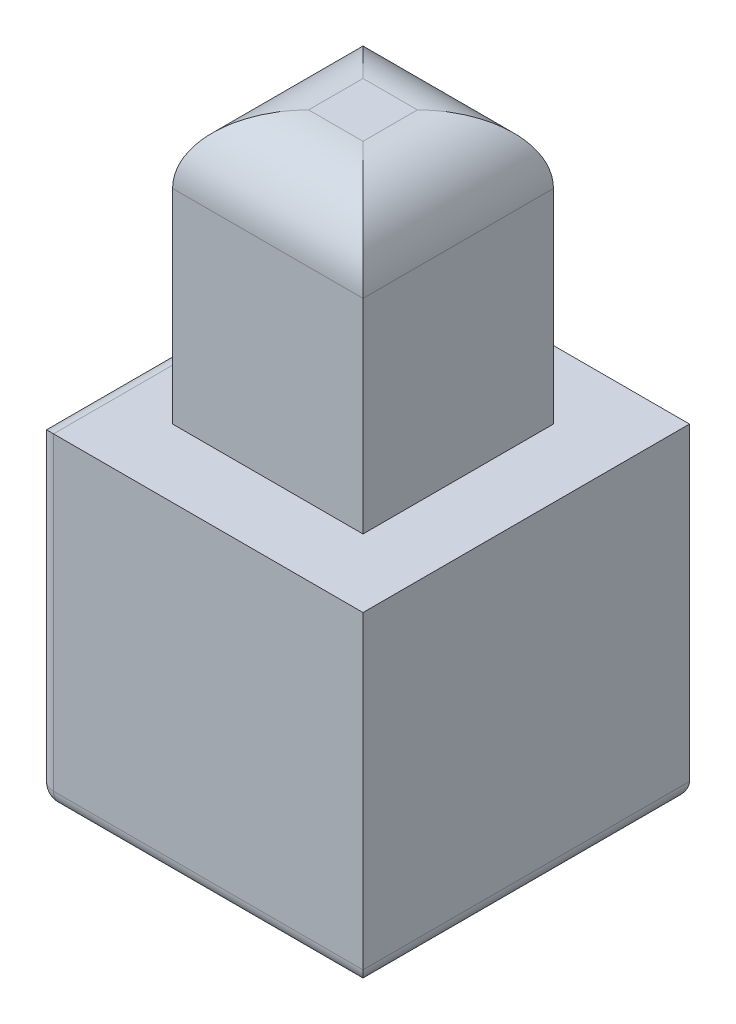
ISO-10303-21;
HEADER;
FILE_DESCRIPTION(('STEP AP214'),'2;1');
FILE_NAME('part.step','',(''),(''),'','','');
FILE_SCHEMA(('AUTOMOTIVE_DESIGN { 1 0 10303 214 1 1 1 1 }'));
ENDSEC;
DATA;
#1=APPLICATION_CONTEXT('core data for automotive mechanical design processes');
#2=APPLICATION_PROTOCOL_DEFINITION('international standard','automotive_design',2000,#1);
#3=PRODUCT_CONTEXT('',#1,'mechanical');
#4=PRODUCT('Part','Part','',(#3));
#5=PRODUCT_RELATED_PRODUCT_CATEGORY('part','',(#4));
#6=PRODUCT_DEFINITION_FORMATION('','',#4);
#7=PRODUCT_DEFINITION_CONTEXT('part definition',#1,'design');
#8=PRODUCT_DEFINITION('design','',#6,#7);
#9=PRODUCT_DEFINITION_SHAPE('','',#8);
#10=(LENGTH_UNIT() NAMED_UNIT(*) SI_UNIT(.MILLI.,.METRE.));
#11=(NAMED_UNIT(*) PLANE_ANGLE_UNIT() SI_UNIT($,.RADIAN.));
#12=(NAMED_UNIT(*) SI_UNIT($,.STERADIAN.) SOLID_ANGLE_UNIT());
#13=UNCERTAINTY_MEASURE_WITH_UNIT(LENGTH_MEASURE(1.E-05),#10,'distance_accuracy_value','');
#14=(GEOMETRIC_REPRESENTATION_CONTEXT(3) GLOBAL_UNCERTAINTY_ASSIGNED_CONTEXT((#13)) GLOBAL_UNIT_ASSIGNED_CONTEXT((#10,
#11,#12)) REPRESENTATION_CONTEXT('',''));
#15=CARTESIAN_POINT('',(0.,0.,0.));
#16=DIRECTION('',(0.,0.,1.));
#17=DIRECTION('',(1.,0.,0.));
#18=AXIS2_PLACEMENT_3D('',#15,#16,#17);
#19=CARTESIAN_POINT('',(2.4,4.8,-2.4));
#20=DIRECTION('',(-1.,0.,0.));
#21=DIRECTION('',(0.,0.,1.));
#22=AXIS2_PLACEMENT_3D('',#19,#20,#21);
#23=PLANE('',#22);
#24=DIRECTION('',(0.,-1.,0.));
#25=VECTOR('',#24,1.);
#26=CARTESIAN_POINT('',(2.4,4.8,2.4));
#27=LINE('',#26,#25);
#28=CARTESIAN_POINT('',(2.4,4.8,2.4));
#29=VERTEX_POINT('',#28);
#30=CARTESIAN_POINT('',(2.4,0.25,2.4));
#31=VERTEX_POINT('',#30);
#32=EDGE_CURVE('E198',#29,#31,#27,.T.);
#33=ORIENTED_EDGE('',*,*,#32,.T.);
#34=DIRECTION('',(0.,0.,-1.));
#35=VECTOR('',#34,1.);
#36=CARTESIAN_POINT('',(2.4,0.25,-2.4));
#37=LINE('',#36,#35);
#38=CARTESIAN_POINT('',(2.4,0.25,-2.4));
#39=VERTEX_POINT('',#38);
#40=EDGE_CURVE('E270',#31,#39,#37,.T.);
#41=ORIENTED_EDGE('',*,*,#40,.T.);
#42=DIRECTION('',(0.,-1.,0.));
#43=VECTOR('',#42,1.);
#44=CARTESIAN_POINT('',(2.4,4.8,-2.4));
#45=LINE('',#44,#43);
#46=CARTESIAN_POINT('',(2.4,4.8,-2.4));
#47=VERTEX_POINT('',#46);
#48=EDGE_CURVE('E202',#47,#39,#45,.T.);
#49=ORIENTED_EDGE('',*,*,#48,.F.);
#50=DIRECTION('',(0.,0.,-1.));
#51=VECTOR('',#50,1.);
#52=CARTESIAN_POINT('',(2.4,4.8,-2.4));
#53=LINE('',#52,#51);
#54=EDGE_CURVE('E187',#29,#47,#53,.T.);
#55=ORIENTED_EDGE('',*,*,#54,.F.);
#56=EDGE_LOOP('',(#33,#41,#49,#55));
#57=FACE_BOUND('',#56,.T.);
#58=ADVANCED_FACE('F41',(#57),#23,.F.);
#59=CARTESIAN_POINT('',(-2.4,4.8,-2.4));
#60=DIRECTION('',(0.,0.,1.));
#61=DIRECTION('',(1.,0.,0.));
#62=AXIS2_PLACEMENT_3D('',#59,#60,#61);
#63=PLANE('',#62);
#64=DIRECTION('',(-1.,0.,0.));
#65=VECTOR('',#64,1.);
#66=CARTESIAN_POINT('',(-2.4,0.25,-2.4));
#67=LINE('',#66,#65);
#68=CARTESIAN_POINT('',(-2.15,0.25,-2.4));
#69=VERTEX_POINT('',#68);
#70=EDGE_CURVE('E231',#39,#69,#67,.T.);
#71=ORIENTED_EDGE('',*,*,#70,.T.);
#72=DIRECTION('',(0.,-1.,0.));
#73=VECTOR('',#72,1.);
#74=CARTESIAN_POINT('',(-2.15,4.8,-2.4));
#75=LINE('',#74,#73);
#76=CARTESIAN_POINT('',(-2.15,4.8,-2.4));
#77=VERTEX_POINT('',#76);
#78=EDGE_CURVE('E11',#69,#77,#75,.F.);
#79=ORIENTED_EDGE('',*,*,#78,.T.);
#80=DIRECTION('',(-1.,0.,0.));
#81=VECTOR('',#80,1.);
#82=CARTESIAN_POINT('',(-2.4,4.8,-2.4));
#83=LINE('',#82,#81);
#84=EDGE_CURVE('E191',#47,#77,#83,.T.);
#85=ORIENTED_EDGE('',*,*,#84,.F.);
#86=ORIENTED_EDGE('',*,*,#48,.T.);
#87=EDGE_LOOP('',(#71,#79,#85,#86));
#88=FACE_BOUND('',#87,.T.);
#89=ADVANCED_FACE('F357',(#88),#63,.F.);
#90=CARTESIAN_POINT('',(-2.4,4.8,-2.4));
#91=DIRECTION('',(1.,0.,0.));
#92=DIRECTION('',(0.,0.,-1.));
#93=AXIS2_PLACEMENT_3D('',#90,#91,#92);
#94=PLANE('',#93);
#95=DIRECTION('',(0.,0.,1.));
#96=VECTOR('',#95,1.);
#97=CARTESIAN_POINT('',(-2.4,0.25,-2.4));
#98=LINE('',#97,#96);
#99=CARTESIAN_POINT('',(-2.4,0.25,-2.15));
#100=VERTEX_POINT('',#99);
#101=CARTESIAN_POINT('',(-2.4,0.25,2.15));
#102=VERTEX_POINT('',#101);
#103=EDGE_CURVE('E264',#100,#102,#98,.T.);
#104=ORIENTED_EDGE('',*,*,#103,.T.);
#105=DIRECTION('',(0.,-1.,0.));
#106=VECTOR('',#105,1.);
#107=CARTESIAN_POINT('',(-2.4,4.8,2.15));
#108=LINE('',#107,#106);
#109=CARTESIAN_POINT('',(-2.4,4.55,2.15));
#110=VERTEX_POINT('',#109);
#111=EDGE_CURVE('E59',#102,#110,#108,.F.);
#112=ORIENTED_EDGE('',*,*,#111,.T.);
#113=DIRECTION('',(0.,0.,1.));
#114=VECTOR('',#113,1.);
#115=CARTESIAN_POINT('',(-2.4,4.55,-2.4));
#116=LINE('',#115,#114);
#117=CARTESIAN_POINT('',(-2.4,4.55,-2.15));
#118=VERTEX_POINT('',#117);
#119=EDGE_CURVE('E63',#110,#118,#116,.F.);
#120=ORIENTED_EDGE('',*,*,#119,.T.);
#121=DIRECTION('',(0.,-1.,0.));
#122=VECTOR('',#121,1.);
#123=CARTESIAN_POINT('',(-2.4,4.8,-2.15));
#124=LINE('',#123,#122);
#125=EDGE_CURVE('E295',#118,#100,#124,.T.);
#126=ORIENTED_EDGE('',*,*,#125,.T.);
#127=EDGE_LOOP('',(#104,#112,#120,#126));
#128=FACE_BOUND('',#127,.T.);
#129=ADVANCED_FACE('F354',(#128),#94,.F.);
#130=CARTESIAN_POINT('',(-2.4,4.8,2.4));
#131=DIRECTION('',(0.,0.,-1.));
#132=DIRECTION('',(-1.,0.,0.));
#133=AXIS2_PLACEMENT_3D('',#130,#131,#132);
#134=PLANE('',#133);
#135=DIRECTION('',(1.,0.,0.));
#136=VECTOR('',#135,1.);
#137=CARTESIAN_POINT('',(-2.4,4.8,2.4));
#138=LINE('',#137,#136);
#139=CARTESIAN_POINT('',(-2.15,4.8,2.4));
#140=VERTEX_POINT('',#139);
#141=EDGE_CURVE('E195',#140,#29,#138,.T.);
#142=ORIENTED_EDGE('',*,*,#141,.F.);
#143=DIRECTION('',(0.,-1.,0.));
#144=VECTOR('',#143,1.);
#145=CARTESIAN_POINT('',(-2.15,4.8,2.4));
#146=LINE('',#145,#144);
#147=CARTESIAN_POINT('',(-2.15,0.25,2.4));
#148=VERTEX_POINT('',#147);
#149=EDGE_CURVE('E51',#140,#148,#146,.T.);
#150=ORIENTED_EDGE('',*,*,#149,.T.);
#151=DIRECTION('',(1.,0.,0.));
#152=VECTOR('',#151,1.);
#153=CARTESIAN_POINT('',(-2.4,0.25,2.4));
#154=LINE('',#153,#152);
#155=EDGE_CURVE('E267',#148,#31,#154,.T.);
#156=ORIENTED_EDGE('',*,*,#155,.T.);
#157=ORIENTED_EDGE('',*,*,#32,.F.);
#158=EDGE_LOOP('',(#142,#150,#156,#157));
#159=FACE_BOUND('',#158,.T.);
#160=ADVANCED_FACE('F356',(#159),#134,.F.);
#161=CARTESIAN_POINT('',(0.,4.8,0.));
#162=DIRECTION('',(0.,1.,0.));
#163=DIRECTION('',(0.,0.,1.));
#164=AXIS2_PLACEMENT_3D('',#161,#162,#163);
#165=PLANE('',#164);
#166=DIRECTION('',(0.,0.,-1.));
#167=VECTOR('',#166,1.);
#168=CARTESIAN_POINT('',(1.4,4.8,-1.4));
#169=LINE('',#168,#167);
#170=CARTESIAN_POINT('',(1.4,4.8,1.4));
#171=VERTEX_POINT('',#170);
#172=CARTESIAN_POINT('',(1.4,4.8,-1.4));
#173=VERTEX_POINT('',#172);
#174=EDGE_CURVE('E172',#171,#173,#169,.T.);
#175=ORIENTED_EDGE('',*,*,#174,.F.);
#176=DIRECTION('',(1.,0.,0.));
#177=VECTOR('',#176,1.);
#178=CARTESIAN_POINT('',(-1.4,4.8,1.4));
#179=LINE('',#178,#177);
#180=CARTESIAN_POINT('',(-1.4,4.8,1.4));
#181=VERTEX_POINT('',#180);
#182=EDGE_CURVE('E166',#181,#171,#179,.T.);
#183=ORIENTED_EDGE('',*,*,#182,.F.);
#184=DIRECTION('',(0.,0.,1.));
#185=VECTOR('',#184,1.);
#186=CARTESIAN_POINT('',(-1.4,4.8,-1.4));
#187=LINE('',#186,#185);
#188=CARTESIAN_POINT('',(-1.4,4.8,-1.4));
#189=VERTEX_POINT('',#188);
#190=EDGE_CURVE('E147',#189,#181,#187,.T.);
#191=ORIENTED_EDGE('',*,*,#190,.F.);
#192=DIRECTION('',(-1.,0.,0.));
#193=VECTOR('',#192,1.);
#194=CARTESIAN_POINT('',(-1.4,4.8,-1.4));
#195=LINE('',#194,#193);
#196=EDGE_CURVE('E163',#173,#189,#195,.T.);
#197=ORIENTED_EDGE('',*,*,#196,.F.);
#198=EDGE_LOOP('',(#175,#183,#191,#197));
#199=FACE_BOUND('',#198,.T.);
#200=ORIENTED_EDGE('',*,*,#84,.T.);
#201=DIRECTION('',(0.,0.,1.));
#202=VECTOR('',#201,1.);
#203=CARTESIAN_POINT('',(-2.15,4.8,2.4));
#204=LINE('',#203,#202);
#205=EDGE_CURVE('E292',#77,#140,#204,.T.);
#206=ORIENTED_EDGE('',*,*,#205,.T.);
#207=ORIENTED_EDGE('',*,*,#141,.T.);
#208=ORIENTED_EDGE('',*,*,#54,.T.);
#209=EDGE_LOOP('',(#200,#206,#207,#208));
#210=FACE_BOUND('',#209,.T.);
#211=ADVANCED_FACE('F161',(#199,#210),#165,.T.);
#212=CARTESIAN_POINT('',(0.,0.,0.));
#213=DIRECTION('',(0.,1.,0.));
#214=DIRECTION('',(0.,0.,1.));
#215=AXIS2_PLACEMENT_3D('',#212,#213,#214);
#216=PLANE('',#215);
#217=DIRECTION('',(0.,0.,1.));
#218=VECTOR('',#217,1.);
#219=CARTESIAN_POINT('',(-2.15,0.,0.));
#220=LINE('',#219,#218);
#221=CARTESIAN_POINT('',(-2.15,0.,2.15));
#222=VERTEX_POINT('',#221);
#223=CARTESIAN_POINT('',(-2.15,0.,-2.15));
#224=VERTEX_POINT('',#223);
#225=EDGE_CURVE('E256',#222,#224,#220,.F.);
#226=ORIENTED_EDGE('',*,*,#225,.T.);
#227=DIRECTION('',(-1.,0.,0.));
#228=VECTOR('',#227,1.);
#229=CARTESIAN_POINT('',(0.,0.,-2.15));
#230=LINE('',#229,#228);
#231=CARTESIAN_POINT('',(2.15,0.,-2.15));
#232=VERTEX_POINT('',#231);
#233=EDGE_CURVE('E260',#224,#232,#230,.F.);
#234=ORIENTED_EDGE('',*,*,#233,.T.);
#235=DIRECTION('',(0.,0.,-1.));
#236=VECTOR('',#235,1.);
#237=CARTESIAN_POINT('',(2.15,0.,0.));
#238=LINE('',#237,#236);
#239=CARTESIAN_POINT('',(2.15,0.,2.15));
#240=VERTEX_POINT('',#239);
#241=EDGE_CURVE('E249',#232,#240,#238,.F.);
#242=ORIENTED_EDGE('',*,*,#241,.T.);
#243=DIRECTION('',(1.,0.,0.));
#244=VECTOR('',#243,1.);
#245=CARTESIAN_POINT('',(0.,0.,2.15));
#246=LINE('',#245,#244);
#247=EDGE_CURVE('E252',#240,#222,#246,.F.);
#248=ORIENTED_EDGE('',*,*,#247,.T.);
#249=EDGE_LOOP('',(#226,#234,#242,#248));
#250=FACE_BOUND('',#249,.T.);
#251=ADVANCED_FACE('F332',(#250),#216,.F.);
#252=CARTESIAN_POINT('',(1.4,8.8,-1.4));
#253=DIRECTION('',(-1.,0.,0.));
#254=DIRECTION('',(0.,0.,1.));
#255=AXIS2_PLACEMENT_3D('',#252,#253,#254);
#256=PLANE('',#255);
#257=DIRECTION('',(0.,-1.,0.));
#258=VECTOR('',#257,1.);
#259=CARTESIAN_POINT('',(1.4,8.8,-1.4));
#260=LINE('',#259,#258);
#261=CARTESIAN_POINT('',(1.4,7.8,-1.4));
#262=VERTEX_POINT('',#261);
#263=EDGE_CURVE('E154',#262,#173,#260,.T.);
#264=ORIENTED_EDGE('',*,*,#263,.F.);
#265=DIRECTION('',(0.,0.,-1.));
#266=VECTOR('',#265,1.);
#267=CARTESIAN_POINT('',(1.4,7.8,1.4));
#268=LINE('',#267,#266);
#269=CARTESIAN_POINT('',(1.4,7.8,1.4));
#270=VERTEX_POINT('',#269);
#271=EDGE_CURVE('E228',#262,#270,#268,.F.);
#272=ORIENTED_EDGE('',*,*,#271,.T.);
#273=DIRECTION('',(0.,-1.,0.));
#274=VECTOR('',#273,1.);
#275=CARTESIAN_POINT('',(1.4,8.8,1.4));
#276=LINE('',#275,#274);
#277=EDGE_CURVE('E180',#270,#171,#276,.T.);
#278=ORIENTED_EDGE('',*,*,#277,.T.);
#279=ORIENTED_EDGE('',*,*,#174,.T.);
#280=EDGE_LOOP('',(#264,#272,#278,#279));
#281=FACE_BOUND('',#280,.T.);
#282=ADVANCED_FACE('F471',(#281),#256,.F.);
#283=CARTESIAN_POINT('',(-1.4,8.8,-1.4));
#284=DIRECTION('',(0.,0.,1.));
#285=DIRECTION('',(1.,0.,0.));
#286=AXIS2_PLACEMENT_3D('',#283,#284,#285);
#287=PLANE('',#286);
#288=DIRECTION('',(0.,-1.,0.));
#289=VECTOR('',#288,1.);
#290=CARTESIAN_POINT('',(-1.4,8.8,-1.4));
#291=LINE('',#290,#289);
#292=CARTESIAN_POINT('',(-1.4,7.8,-1.4));
#293=VERTEX_POINT('',#292);
#294=EDGE_CURVE('E143',#293,#189,#291,.T.);
#295=ORIENTED_EDGE('',*,*,#294,.F.);
#296=DIRECTION('',(-1.,0.,0.));
#297=VECTOR('',#296,1.);
#298=CARTESIAN_POINT('',(1.4,7.8,-1.4));
#299=LINE('',#298,#297);
#300=EDGE_CURVE('E225',#293,#262,#299,.F.);
#301=ORIENTED_EDGE('',*,*,#300,.T.);
#302=ORIENTED_EDGE('',*,*,#263,.T.);
#303=ORIENTED_EDGE('',*,*,#196,.T.);
#304=EDGE_LOOP('',(#295,#301,#302,#303));
#305=FACE_BOUND('',#304,.T.);
#306=ADVANCED_FACE('F169',(#305),#287,.F.);
#307=CARTESIAN_POINT('',(-1.4,8.8,-1.4));
#308=DIRECTION('',(1.,0.,0.));
#309=DIRECTION('',(0.,0.,-1.));
#310=AXIS2_PLACEMENT_3D('',#307,#308,#309);
#311=PLANE('',#310);
#312=DIRECTION('',(0.,-1.,0.));
#313=VECTOR('',#312,1.);
#314=CARTESIAN_POINT('',(-1.4,8.8,1.4));
#315=LINE('',#314,#313);
#316=CARTESIAN_POINT('',(-1.4,7.8,1.4));
#317=VERTEX_POINT('',#316);
#318=EDGE_CURVE('E155',#317,#181,#315,.T.);
#319=ORIENTED_EDGE('',*,*,#318,.F.);
#320=DIRECTION('',(0.,0.,1.));
#321=VECTOR('',#320,1.);
#322=CARTESIAN_POINT('',(-1.4,7.8,-1.4));
#323=LINE('',#322,#321);
#324=EDGE_CURVE('E149',#317,#293,#323,.F.);
#325=ORIENTED_EDGE('',*,*,#324,.T.);
#326=ORIENTED_EDGE('',*,*,#294,.T.);
#327=ORIENTED_EDGE('',*,*,#190,.T.);
#328=EDGE_LOOP('',(#319,#325,#326,#327));
#329=FACE_BOUND('',#328,.T.);
#330=ADVANCED_FACE('F146',(#329),#311,.F.);
#331=CARTESIAN_POINT('',(-1.4,8.8,1.4));
#332=DIRECTION('',(0.,0.,-1.));
#333=DIRECTION('',(-1.,0.,0.));
#334=AXIS2_PLACEMENT_3D('',#331,#332,#333);
#335=PLANE('',#334);
#336=ORIENTED_EDGE('',*,*,#277,.F.);
#337=DIRECTION('',(1.,0.,0.));
#338=VECTOR('',#337,1.);
#339=CARTESIAN_POINT('',(-1.4,7.8,1.4));
#340=LINE('',#339,#338);
#341=EDGE_CURVE('E219',#270,#317,#340,.F.);
#342=ORIENTED_EDGE('',*,*,#341,.T.);
#343=ORIENTED_EDGE('',*,*,#318,.T.);
#344=ORIENTED_EDGE('',*,*,#182,.T.);
#345=EDGE_LOOP('',(#336,#342,#343,#344));
#346=FACE_BOUND('',#345,.T.);
#347=ADVANCED_FACE('F450',(#346),#335,.F.);
#348=CARTESIAN_POINT('',(0.,8.8,0.));
#349=DIRECTION('',(0.,1.,0.));
#350=DIRECTION('',(0.,0.,1.));
#351=AXIS2_PLACEMENT_3D('',#348,#349,#350);
#352=PLANE('',#351);
#353=DIRECTION('',(0.,0.,1.));
#354=VECTOR('',#353,1.);
#355=CARTESIAN_POINT('',(-0.4,8.8,1.4));
#356=LINE('',#355,#354);
#357=CARTESIAN_POINT('',(-0.4,8.8,-0.399999999999999));
#358=VERTEX_POINT('',#357);
#359=CARTESIAN_POINT('',(-0.4,8.8,0.400000000000001));
#360=VERTEX_POINT('',#359);
#361=EDGE_CURVE('E212',#358,#360,#356,.T.);
#362=ORIENTED_EDGE('',*,*,#361,.T.);
#363=DIRECTION('',(1.,0.,0.));
#364=VECTOR('',#363,1.);
#365=CARTESIAN_POINT('',(1.4,8.8,0.400000000000001));
#366=LINE('',#365,#364);
#367=CARTESIAN_POINT('',(0.4,8.8,0.400000000000001));
#368=VERTEX_POINT('',#367);
#369=EDGE_CURVE('E215',#360,#368,#366,.T.);
#370=ORIENTED_EDGE('',*,*,#369,.T.);
#371=DIRECTION('',(0.,0.,-1.));
#372=VECTOR('',#371,1.);
#373=CARTESIAN_POINT('',(0.4,8.8,-1.4));
#374=LINE('',#373,#372);
#375=CARTESIAN_POINT('',(0.4,8.8,-0.399999999999999));
#376=VERTEX_POINT('',#375);
#377=EDGE_CURVE('E206',#368,#376,#374,.T.);
#378=ORIENTED_EDGE('',*,*,#377,.T.);
#379=DIRECTION('',(-1.,0.,0.));
#380=VECTOR('',#379,1.);
#381=CARTESIAN_POINT('',(-1.4,8.8,-0.399999999999999));
#382=LINE('',#381,#380);
#383=EDGE_CURVE('E209',#376,#358,#382,.T.);
#384=ORIENTED_EDGE('',*,*,#383,.T.);
#385=EDGE_LOOP('',(#362,#370,#378,#384));
#386=FACE_BOUND('',#385,.T.);
#387=ADVANCED_FACE('F388',(#386),#352,.T.);
#388=CARTESIAN_POINT('',(0.,7.8,-0.399999999999999));
#389=DIRECTION('',(1.,0.,0.));
#390=DIRECTION('',(0.,0.,-1.));
#391=AXIS2_PLACEMENT_3D('',#388,#389,#390);
#392=CYLINDRICAL_SURFACE('',#391,1.);
#393=CARTESIAN_POINT('',(0.4,7.8,-0.399999999999999));
#394=DIRECTION('',(0.707106781186548,0.,0.707106781186547));
#395=DIRECTION('',(-0.707106781186547,0.,0.707106781186548));
#396=AXIS2_PLACEMENT_3D('',#393,#394,#395);
#397=ELLIPSE('',#396,1.41421356237309,1.);
#398=EDGE_CURVE('E239',#262,#376,#397,.T.);
#399=ORIENTED_EDGE('',*,*,#398,.F.);
#400=ORIENTED_EDGE('',*,*,#300,.F.);
#401=CARTESIAN_POINT('',(-0.4,7.8,-0.399999999999999));
#402=DIRECTION('',(0.707106781186547,0.,-0.707106781186548));
#403=DIRECTION('',(0.707106781186548,0.,0.707106781186547));
#404=AXIS2_PLACEMENT_3D('',#401,#402,#403);
#405=ELLIPSE('',#404,1.4142135623731,1.);
#406=EDGE_CURVE('E175',#358,#293,#405,.F.);
#407=ORIENTED_EDGE('',*,*,#406,.F.);
#408=ORIENTED_EDGE('',*,*,#383,.F.);
#409=EDGE_LOOP('',(#399,#400,#407,#408));
#410=FACE_BOUND('',#409,.T.);
#411=ADVANCED_FACE('F384',(#410),#392,.T.);
#412=CARTESIAN_POINT('',(-0.4,7.8,0.));
#413=DIRECTION('',(0.,0.,-1.));
#414=DIRECTION('',(-1.,0.,0.));
#415=AXIS2_PLACEMENT_3D('',#412,#413,#414);
#416=CYLINDRICAL_SURFACE('',#415,1.);
#417=ORIENTED_EDGE('',*,*,#406,.T.);
#418=ORIENTED_EDGE('',*,*,#324,.F.);
#419=CARTESIAN_POINT('',(-0.4,7.8,0.400000000000001));
#420=DIRECTION('',(-0.707106781186548,0.,-0.707106781186547));
#421=DIRECTION('',(0.707106781186547,0.,-0.707106781186548));
#422=AXIS2_PLACEMENT_3D('',#419,#420,#421);
#423=ELLIPSE('',#422,1.41421356237309,1.);
#424=EDGE_CURVE('E235',#360,#317,#423,.F.);
#425=ORIENTED_EDGE('',*,*,#424,.F.);
#426=ORIENTED_EDGE('',*,*,#361,.F.);
#427=EDGE_LOOP('',(#417,#418,#425,#426));
#428=FACE_BOUND('',#427,.T.);
#429=ADVANCED_FACE('F380',(#428),#416,.T.);
#430=CARTESIAN_POINT('',(0.4,7.8,0.));
#431=DIRECTION('',(0.,0.,1.));
#432=DIRECTION('',(1.,0.,0.));
#433=AXIS2_PLACEMENT_3D('',#430,#431,#432);
#434=CYLINDRICAL_SURFACE('',#433,1.);
#435=ORIENTED_EDGE('',*,*,#398,.T.);
#436=ORIENTED_EDGE('',*,*,#377,.F.);
#437=CARTESIAN_POINT('',(0.4,7.8,0.400000000000001));
#438=DIRECTION('',(-0.707106781186547,0.,0.707106781186548));
#439=DIRECTION('',(0.707106781186548,0.,0.707106781186547));
#440=AXIS2_PLACEMENT_3D('',#437,#438,#439);
#441=ELLIPSE('',#440,1.4142135623731,1.);
#442=EDGE_CURVE('E232',#270,#368,#441,.T.);
#443=ORIENTED_EDGE('',*,*,#442,.F.);
#444=ORIENTED_EDGE('',*,*,#271,.F.);
#445=EDGE_LOOP('',(#435,#436,#443,#444));
#446=FACE_BOUND('',#445,.T.);
#447=ADVANCED_FACE('F376',(#446),#434,.T.);
#448=CARTESIAN_POINT('',(0.,7.8,0.400000000000001));
#449=DIRECTION('',(-1.,0.,0.));
#450=DIRECTION('',(0.,0.,1.));
#451=AXIS2_PLACEMENT_3D('',#448,#449,#450);
#452=CYLINDRICAL_SURFACE('',#451,1.);
#453=ORIENTED_EDGE('',*,*,#424,.T.);
#454=ORIENTED_EDGE('',*,*,#341,.F.);
#455=ORIENTED_EDGE('',*,*,#442,.T.);
#456=ORIENTED_EDGE('',*,*,#369,.F.);
#457=EDGE_LOOP('',(#453,#454,#455,#456));
#458=FACE_BOUND('',#457,.T.);
#459=ADVANCED_FACE('F373',(#458),#452,.T.);
#460=CARTESIAN_POINT('',(-2.4,0.25,2.15));
#461=DIRECTION('',(1.,0.,0.));
#462=DIRECTION('',(0.,0.,-1.));
#463=AXIS2_PLACEMENT_3D('',#460,#461,#462);
#464=CYLINDRICAL_SURFACE('',#463,0.25);
#465=ORIENTED_EDGE('',*,*,#155,.F.);
#466=CARTESIAN_POINT('',(-2.15,0.25,2.15));
#467=DIRECTION('',(1.,0.,0.));
#468=DIRECTION('',(0.,0.,-1.));
#469=AXIS2_PLACEMENT_3D('',#466,#467,#468);
#470=CIRCLE('',#469,0.25);
#471=EDGE_CURVE('E286',#148,#222,#470,.T.);
#472=ORIENTED_EDGE('',*,*,#471,.T.);
#473=ORIENTED_EDGE('',*,*,#247,.F.);
#474=CARTESIAN_POINT('',(2.15,0.25,2.15));
#475=DIRECTION('',(0.707106781186547,0.,-0.707106781186547));
#476=DIRECTION('',(-0.707106781186547,0.,-0.707106781186547));
#477=AXIS2_PLACEMENT_3D('',#474,#475,#476);
#478=ELLIPSE('',#477,0.353553390593274,0.25);
#479=EDGE_CURVE('E236',#31,#240,#478,.T.);
#480=ORIENTED_EDGE('',*,*,#479,.F.);
#481=EDGE_LOOP('',(#465,#472,#473,#480));
#482=FACE_BOUND('',#481,.T.);
#483=ADVANCED_FACE('F345',(#482),#464,.T.);
#484=CARTESIAN_POINT('',(2.15,0.25,-2.4));
#485=DIRECTION('',(0.,0.,-1.));
#486=DIRECTION('',(-1.,0.,0.));
#487=AXIS2_PLACEMENT_3D('',#484,#485,#486);
#488=CYLINDRICAL_SURFACE('',#487,0.25);
#489=ORIENTED_EDGE('',*,*,#479,.T.);
#490=ORIENTED_EDGE('',*,*,#241,.F.);
#491=CARTESIAN_POINT('',(2.15,0.25,-2.15));
#492=DIRECTION('',(-0.707106781186547,0.,-0.707106781186547));
#493=DIRECTION('',(0.707106781186547,0.,-0.707106781186547));
#494=AXIS2_PLACEMENT_3D('',#491,#492,#493);
#495=ELLIPSE('',#494,0.353553390593274,0.25);
#496=EDGE_CURVE('E274',#39,#232,#495,.T.);
#497=ORIENTED_EDGE('',*,*,#496,.F.);
#498=ORIENTED_EDGE('',*,*,#40,.F.);
#499=EDGE_LOOP('',(#489,#490,#497,#498));
#500=FACE_BOUND('',#499,.T.);
#501=ADVANCED_FACE('F341',(#500),#488,.T.);
#502=CARTESIAN_POINT('',(-2.15,0.25,-2.4));
#503=DIRECTION('',(0.,0.,1.));
#504=DIRECTION('',(1.,0.,0.));
#505=AXIS2_PLACEMENT_3D('',#502,#503,#504);
#506=CYLINDRICAL_SURFACE('',#505,0.25);
#507=ORIENTED_EDGE('',*,*,#225,.F.);
#508=CARTESIAN_POINT('',(-2.15,0.25,2.15));
#509=DIRECTION('',(0.,0.,1.));
#510=DIRECTION('',(1.,0.,0.));
#511=AXIS2_PLACEMENT_3D('',#508,#509,#510);
#512=CIRCLE('',#511,0.25);
#513=EDGE_CURVE('E282',#222,#102,#512,.F.);
#514=ORIENTED_EDGE('',*,*,#513,.T.);
#515=ORIENTED_EDGE('',*,*,#103,.F.);
#516=CARTESIAN_POINT('',(-2.15,0.25,-2.15));
#517=DIRECTION('',(0.,0.,1.));
#518=DIRECTION('',(1.,0.,0.));
#519=AXIS2_PLACEMENT_3D('',#516,#517,#518);
#520=CIRCLE('',#519,0.25);
#521=EDGE_CURVE('E273',#100,#224,#520,.T.);
#522=ORIENTED_EDGE('',*,*,#521,.T.);
#523=EDGE_LOOP('',(#507,#514,#515,#522));
#524=FACE_BOUND('',#523,.T.);
#525=ADVANCED_FACE('F328',(#524),#506,.T.);
#526=CARTESIAN_POINT('',(-2.4,0.25,-2.15));
#527=DIRECTION('',(-1.,0.,0.));
#528=DIRECTION('',(0.,0.,1.));
#529=AXIS2_PLACEMENT_3D('',#526,#527,#528);
#530=CYLINDRICAL_SURFACE('',#529,0.25);
#531=ORIENTED_EDGE('',*,*,#233,.F.);
#532=CARTESIAN_POINT('',(-2.15,0.25,-2.15));
#533=DIRECTION('',(-1.,0.,0.));
#534=DIRECTION('',(0.,0.,1.));
#535=AXIS2_PLACEMENT_3D('',#532,#533,#534);
#536=CIRCLE('',#535,0.25);
#537=EDGE_CURVE('E289',#224,#69,#536,.F.);
#538=ORIENTED_EDGE('',*,*,#537,.T.);
#539=ORIENTED_EDGE('',*,*,#70,.F.);
#540=ORIENTED_EDGE('',*,*,#496,.T.);
#541=EDGE_LOOP('',(#531,#538,#539,#540));
#542=FACE_BOUND('',#541,.T.);
#543=ADVANCED_FACE('F335',(#542),#530,.T.);
#544=CARTESIAN_POINT('',(-2.15,0.25,-2.15));
#545=DIRECTION('',(0.,0.,1.));
#546=DIRECTION('',(1.,0.,0.));
#547=AXIS2_PLACEMENT_3D('',#544,#545,#546);
#548=SPHERICAL_SURFACE('',#547,0.25);
#549=ORIENTED_EDGE('',*,*,#537,.F.);
#550=ORIENTED_EDGE('',*,*,#521,.F.);
#551=CARTESIAN_POINT('',(-2.15,0.25,-2.15));
#552=DIRECTION('',(0.,1.,0.));
#553=DIRECTION('',(0.,0.,1.));
#554=AXIS2_PLACEMENT_3D('',#551,#552,#553);
#555=CIRCLE('',#554,0.25);
#556=EDGE_CURVE('E45',#69,#100,#555,.T.);
#557=ORIENTED_EDGE('',*,*,#556,.F.);
#558=EDGE_LOOP('',(#549,#550,#557));
#559=FACE_BOUND('',#558,.T.);
#560=ADVANCED_FACE('F43',(#559),#548,.T.);
#561=CARTESIAN_POINT('',(-2.15,4.8,-2.15));
#562=DIRECTION('',(0.,-1.,0.));
#563=DIRECTION('',(0.,0.,-1.));
#564=AXIS2_PLACEMENT_3D('',#561,#562,#563);
#565=CYLINDRICAL_SURFACE('',#564,0.25);
#566=ORIENTED_EDGE('',*,*,#556,.T.);
#567=ORIENTED_EDGE('',*,*,#125,.F.);
#568=CARTESIAN_POINT('',(-2.15,4.55,-2.15));
#569=DIRECTION('',(0.,-0.707106781186547,-0.707106781186547));
#570=DIRECTION('',(0.,-0.707106781186547,0.707106781186547));
#571=AXIS2_PLACEMENT_3D('',#568,#569,#570);
#572=ELLIPSE('',#571,0.353553390593274,0.25);
#573=EDGE_CURVE('E310',#77,#118,#572,.F.);
#574=ORIENTED_EDGE('',*,*,#573,.F.);
#575=ORIENTED_EDGE('',*,*,#78,.F.);
#576=EDGE_LOOP('',(#566,#567,#574,#575));
#577=FACE_BOUND('',#576,.T.);
#578=ADVANCED_FACE('F321',(#577),#565,.T.);
#579=CARTESIAN_POINT('',(-2.15,4.55,0.));
#580=DIRECTION('',(0.,0.,-1.));
#581=DIRECTION('',(-1.,0.,0.));
#582=AXIS2_PLACEMENT_3D('',#579,#580,#581);
#583=CYLINDRICAL_SURFACE('',#582,0.25);
#584=ORIENTED_EDGE('',*,*,#573,.T.);
#585=ORIENTED_EDGE('',*,*,#119,.F.);
#586=CARTESIAN_POINT('',(-2.15,4.55,2.15));
#587=DIRECTION('',(0.,-0.707106781186547,0.707106781186547));
#588=DIRECTION('',(0.,-0.707106781186547,-0.707106781186547));
#589=AXIS2_PLACEMENT_3D('',#586,#587,#588);
#590=ELLIPSE('',#589,0.353553390593274,0.25);
#591=EDGE_CURVE('E307',#140,#110,#590,.T.);
#592=ORIENTED_EDGE('',*,*,#591,.F.);
#593=ORIENTED_EDGE('',*,*,#205,.F.);
#594=EDGE_LOOP('',(#584,#585,#592,#593));
#595=FACE_BOUND('',#594,.T.);
#596=ADVANCED_FACE('F402',(#595),#583,.T.);
#597=CARTESIAN_POINT('',(-2.15,4.8,2.15));
#598=DIRECTION('',(0.,-1.,0.));
#599=DIRECTION('',(0.,0.,-1.));
#600=AXIS2_PLACEMENT_3D('',#597,#598,#599);
#601=CYLINDRICAL_SURFACE('',#600,0.25);
#602=ORIENTED_EDGE('',*,*,#591,.T.);
#603=ORIENTED_EDGE('',*,*,#111,.F.);
#604=CARTESIAN_POINT('',(-2.15,0.25,2.15));
#605=DIRECTION('',(0.,-1.,0.));
#606=DIRECTION('',(0.,0.,-1.));
#607=AXIS2_PLACEMENT_3D('',#604,#605,#606);
#608=CIRCLE('',#607,0.25);
#609=EDGE_CURVE('E304',#148,#102,#608,.T.);
#610=ORIENTED_EDGE('',*,*,#609,.F.);
#611=ORIENTED_EDGE('',*,*,#149,.F.);
#612=EDGE_LOOP('',(#602,#603,#610,#611));
#613=FACE_BOUND('',#612,.T.);
#614=ADVANCED_FACE('F352',(#613),#601,.T.);
#615=CARTESIAN_POINT('',(-2.15,0.25,2.15));
#616=DIRECTION('',(0.,0.,1.));
#617=DIRECTION('',(1.,0.,0.));
#618=AXIS2_PLACEMENT_3D('',#615,#616,#617);
#619=SPHERICAL_SURFACE('',#618,0.25);
#620=ORIENTED_EDGE('',*,*,#513,.F.);
#621=ORIENTED_EDGE('',*,*,#471,.F.);
#622=ORIENTED_EDGE('',*,*,#609,.T.);
#623=EDGE_LOOP('',(#620,#621,#622));
#624=FACE_BOUND('',#623,.T.);
#625=ADVANCED_FACE('F349',(#624),#619,.T.);
#626=CLOSED_SHELL('',(#58,#89,#129,#160,#211,#251,#282,#306,#330,#347,#387,#411,#429,#447,#459,
#483,#501,#525,#543,#560,#578,#596,#614,#625));
#627=MANIFOLD_SOLID_BREP('B2',#626);
#628=ADVANCED_BREP_SHAPE_REPRESENTATION('',(#18,#627),#14);
#629=SHAPE_DEFINITION_REPRESENTATION(#9,#628);
ENDSEC;
END-ISO-10303-21;
